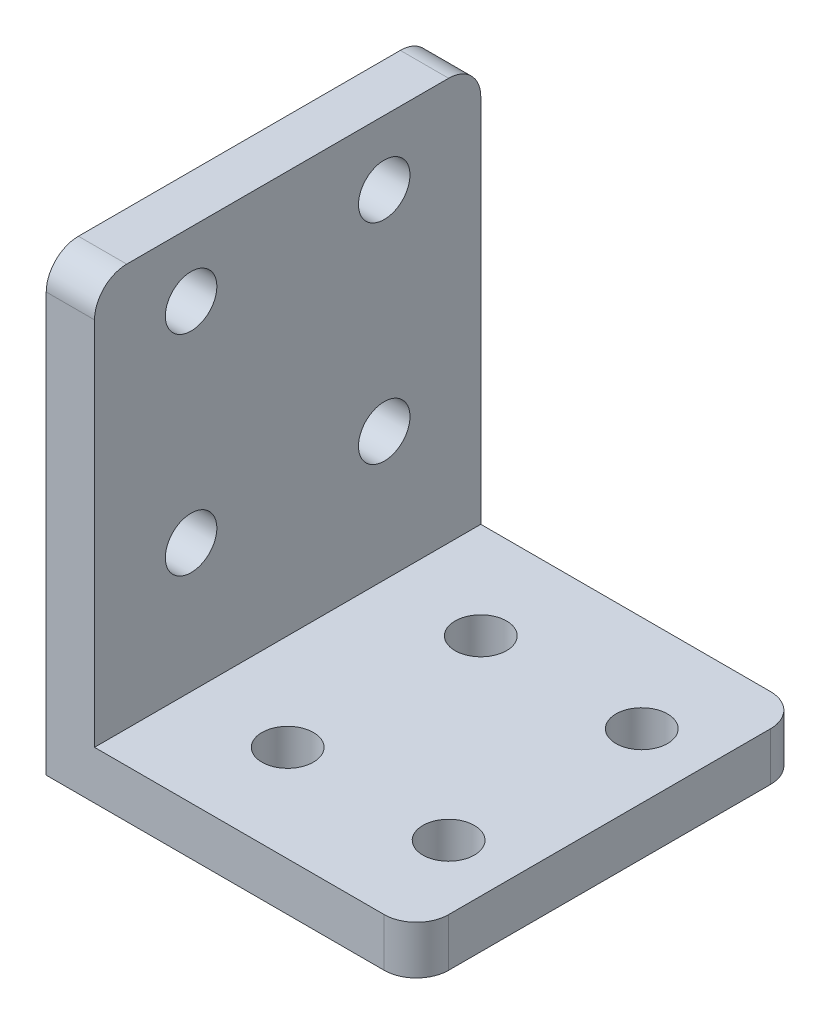
ISO-10303-21;
HEADER;
FILE_DESCRIPTION(('STEP AP214'),'2;1');
FILE_NAME('part.step','',(''),(''),'','','');
FILE_SCHEMA(('AUTOMOTIVE_DESIGN { 1 0 10303 214 1 1 1 1 }'));
ENDSEC;
DATA;
#1=APPLICATION_CONTEXT('core data for automotive mechanical design processes');
#2=APPLICATION_PROTOCOL_DEFINITION('international standard','automotive_design',2000,#1);
#3=PRODUCT_CONTEXT('',#1,'mechanical');
#4=PRODUCT('Part','Part','',(#3));
#5=PRODUCT_RELATED_PRODUCT_CATEGORY('part','',(#4));
#6=PRODUCT_DEFINITION_FORMATION('','',#4);
#7=PRODUCT_DEFINITION_CONTEXT('part definition',#1,'design');
#8=PRODUCT_DEFINITION('design','',#6,#7);
#9=PRODUCT_DEFINITION_SHAPE('','',#8);
#10=(LENGTH_UNIT() NAMED_UNIT(*) SI_UNIT(.MILLI.,.METRE.));
#11=(NAMED_UNIT(*) PLANE_ANGLE_UNIT() SI_UNIT($,.RADIAN.));
#12=(NAMED_UNIT(*) SI_UNIT($,.STERADIAN.) SOLID_ANGLE_UNIT());
#13=UNCERTAINTY_MEASURE_WITH_UNIT(LENGTH_MEASURE(1.E-05),#10,'distance_accuracy_value','');
#14=(GEOMETRIC_REPRESENTATION_CONTEXT(3) GLOBAL_UNCERTAINTY_ASSIGNED_CONTEXT((#13)) GLOBAL_UNIT_ASSIGNED_CONTEXT((#10,
#11,#12)) REPRESENTATION_CONTEXT('',''));
#15=CARTESIAN_POINT('',(0.,0.,0.));
#16=DIRECTION('',(0.,0.,1.));
#17=DIRECTION('',(1.,0.,0.));
#18=AXIS2_PLACEMENT_3D('',#15,#16,#17);
#19=CARTESIAN_POINT('',(0.,101.691622654979,-24.));
#20=DIRECTION('',(0.,-1.,0.));
#21=DIRECTION('',(0.,0.,-1.));
#22=AXIS2_PLACEMENT_3D('',#19,#20,#21);
#23=PLANE('',#22);
#24=CARTESIAN_POINT('',(12.0000000000001,101.691622654979,-18.));
#25=DIRECTION('',(0.,-1.,0.));
#26=DIRECTION('',(0.,0.,-1.));
#27=AXIS2_PLACEMENT_3D('',#24,#25,#26);
#28=CIRCLE('',#27,1.6);
#29=CARTESIAN_POINT('',(12.0000000000001,101.691622654979,-19.6));
#30=VERTEX_POINT('',#29);
#31=EDGE_CURVE('E211',#30,#30,#28,.T.);
#32=ORIENTED_EDGE('',*,*,#31,.F.);
#33=EDGE_LOOP('',(#32));
#34=FACE_BOUND('',#33,.T.);
#35=CARTESIAN_POINT('',(12.0000000000001,101.691622654979,-6.));
#36=DIRECTION('',(0.,-1.,0.));
#37=DIRECTION('',(0.,0.,-1.));
#38=AXIS2_PLACEMENT_3D('',#35,#36,#37);
#39=CIRCLE('',#38,1.6);
#40=CARTESIAN_POINT('',(12.0000000000001,101.691622654979,-7.6));
#41=VERTEX_POINT('',#40);
#42=EDGE_CURVE('E335',#41,#41,#39,.T.);
#43=ORIENTED_EDGE('',*,*,#42,.F.);
#44=EDGE_LOOP('',(#43));
#45=FACE_BOUND('',#44,.T.);
#46=CARTESIAN_POINT('',(22.0000000000001,101.691622654979,-6.));
#47=DIRECTION('',(0.,-1.,0.));
#48=DIRECTION('',(0.,0.,-1.));
#49=AXIS2_PLACEMENT_3D('',#46,#47,#48);
#50=CIRCLE('',#49,1.6);
#51=CARTESIAN_POINT('',(22.0000000000001,101.691622654979,-7.6));
#52=VERTEX_POINT('',#51);
#53=EDGE_CURVE('E224',#52,#52,#50,.T.);
#54=ORIENTED_EDGE('',*,*,#53,.F.);
#55=EDGE_LOOP('',(#54));
#56=FACE_BOUND('',#55,.T.);
#57=CARTESIAN_POINT('',(22.0000000000001,101.691622654979,-18.));
#58=DIRECTION('',(0.,-1.,0.));
#59=DIRECTION('',(0.,0.,-1.));
#60=AXIS2_PLACEMENT_3D('',#57,#58,#59);
#61=CIRCLE('',#60,1.6);
#62=CARTESIAN_POINT('',(22.0000000000001,101.691622654979,-19.6));
#63=VERTEX_POINT('',#62);
#64=EDGE_CURVE('E219',#63,#63,#61,.T.);
#65=ORIENTED_EDGE('',*,*,#64,.F.);
#66=EDGE_LOOP('',(#65));
#67=FACE_BOUND('',#66,.T.);
#68=DIRECTION('',(1.,0.,0.));
#69=VECTOR('',#68,1.);
#70=CARTESIAN_POINT('',(0.,101.691622654979,-24.));
#71=LINE('',#70,#69);
#72=CARTESIAN_POINT('',(3.00000000000017,101.691622654979,-24.));
#73=VERTEX_POINT('',#72);
#74=CARTESIAN_POINT('',(24.0000000000001,101.691622654979,-24.));
#75=VERTEX_POINT('',#74);
#76=EDGE_CURVE('E142',#73,#75,#71,.T.);
#77=ORIENTED_EDGE('',*,*,#76,.T.);
#78=CARTESIAN_POINT('',(24.0000000000001,101.691622654979,-22.));
#79=DIRECTION('',(0.,-1.,0.));
#80=DIRECTION('',(0.,0.,-1.));
#81=AXIS2_PLACEMENT_3D('',#78,#79,#80);
#82=CIRCLE('',#81,2.);
#83=CARTESIAN_POINT('',(26.0000000000001,101.691622654979,-22.));
#84=VERTEX_POINT('',#83);
#85=EDGE_CURVE('E183',#75,#84,#82,.T.);
#86=ORIENTED_EDGE('',*,*,#85,.T.);
#87=DIRECTION('',(0.,0.,1.));
#88=VECTOR('',#87,1.);
#89=CARTESIAN_POINT('',(26.0000000000001,101.691622654979,-24.));
#90=LINE('',#89,#88);
#91=CARTESIAN_POINT('',(26.0000000000001,101.691622654979,-2.));
#92=VERTEX_POINT('',#91);
#93=EDGE_CURVE('E150',#84,#92,#90,.T.);
#94=ORIENTED_EDGE('',*,*,#93,.T.);
#95=CARTESIAN_POINT('',(24.0000000000001,101.691622654979,-2.));
#96=DIRECTION('',(0.,-1.,0.));
#97=DIRECTION('',(0.,0.,-1.));
#98=AXIS2_PLACEMENT_3D('',#95,#96,#97);
#99=CIRCLE('',#98,2.);
#100=CARTESIAN_POINT('',(24.0000000000001,101.691622654979,0.));
#101=VERTEX_POINT('',#100);
#102=EDGE_CURVE('E181',#92,#101,#99,.T.);
#103=ORIENTED_EDGE('',*,*,#102,.T.);
#104=DIRECTION('',(1.,0.,0.));
#105=VECTOR('',#104,1.);
#106=CARTESIAN_POINT('',(0.,101.691622654979,0.));
#107=LINE('',#106,#105);
#108=CARTESIAN_POINT('',(3.00000000000017,101.691622654979,0.));
#109=VERTEX_POINT('',#108);
#110=EDGE_CURVE('E151',#109,#101,#107,.T.);
#111=ORIENTED_EDGE('',*,*,#110,.F.);
#112=DIRECTION('',(0.,0.,1.));
#113=VECTOR('',#112,1.);
#114=CARTESIAN_POINT('',(3.00000000000017,101.691622654979,-24.));
#115=LINE('',#114,#113);
#116=EDGE_CURVE('E159',#73,#109,#115,.T.);
#117=ORIENTED_EDGE('',*,*,#116,.F.);
#118=EDGE_LOOP('',(#77,#86,#94,#103,#111,#117));
#119=FACE_BOUND('',#118,.T.);
#120=ADVANCED_FACE('F36',(#34,#45,#56,#67,#119),#23,.T.);
#121=CARTESIAN_POINT('',(3.0000000000006,0.,-24.));
#122=DIRECTION('',(-1.,0.,0.));
#123=DIRECTION('',(0.,-1.,0.));
#124=AXIS2_PLACEMENT_3D('',#121,#122,#123);
#125=PLANE('',#124);
#126=CARTESIAN_POINT('',(3.00000000000012,112.691622654979,-18.0000000000001));
#127=DIRECTION('',(-1.,0.,0.));
#128=DIRECTION('',(0.,-1.,0.));
#129=AXIS2_PLACEMENT_3D('',#126,#127,#128);
#130=CIRCLE('',#129,1.60000000000001);
#131=CARTESIAN_POINT('',(3.00000000000013,111.091622654979,-18.0000000000001));
#132=VERTEX_POINT('',#131);
#133=EDGE_CURVE('E200',#132,#132,#130,.T.);
#134=ORIENTED_EDGE('',*,*,#133,.F.);
#135=EDGE_LOOP('',(#134));
#136=FACE_BOUND('',#135,.T.);
#137=CARTESIAN_POINT('',(3.00000000000012,112.691622654979,-6.00000000000011));
#138=DIRECTION('',(-1.,0.,0.));
#139=DIRECTION('',(0.,-1.,0.));
#140=AXIS2_PLACEMENT_3D('',#137,#138,#139);
#141=CIRCLE('',#140,1.60000000000002);
#142=CARTESIAN_POINT('',(3.00000000000013,111.091622654979,-6.00000000000011));
#143=VERTEX_POINT('',#142);
#144=EDGE_CURVE('E206',#143,#143,#141,.T.);
#145=ORIENTED_EDGE('',*,*,#144,.F.);
#146=EDGE_LOOP('',(#145));
#147=FACE_BOUND('',#146,.T.);
#148=CARTESIAN_POINT('',(3.00000000000007,125.691622654979,-6.));
#149=DIRECTION('',(-1.,0.,0.));
#150=DIRECTION('',(0.,-1.,0.));
#151=AXIS2_PLACEMENT_3D('',#148,#149,#150);
#152=CIRCLE('',#151,1.6);
#153=CARTESIAN_POINT('',(3.00000000000007,124.091622654979,-6.));
#154=VERTEX_POINT('',#153);
#155=EDGE_CURVE('E155',#154,#154,#152,.T.);
#156=ORIENTED_EDGE('',*,*,#155,.F.);
#157=EDGE_LOOP('',(#156));
#158=FACE_BOUND('',#157,.T.);
#159=CARTESIAN_POINT('',(3.00000000000007,125.691622654979,-18.));
#160=DIRECTION('',(-1.,0.,0.));
#161=DIRECTION('',(0.,-1.,0.));
#162=AXIS2_PLACEMENT_3D('',#159,#160,#161);
#163=CIRCLE('',#162,1.60000000000001);
#164=CARTESIAN_POINT('',(3.00000000000007,124.091622654979,-18.));
#165=VERTEX_POINT('',#164);
#166=EDGE_CURVE('E231',#165,#165,#163,.T.);
#167=ORIENTED_EDGE('',*,*,#166,.F.);
#168=EDGE_LOOP('',(#167));
#169=FACE_BOUND('',#168,.T.);
#170=DIRECTION('',(0.,0.,1.));
#171=VECTOR('',#170,1.);
#172=CARTESIAN_POINT('',(3.00000000000005,129.691622654979,-24.));
#173=LINE('',#172,#171);
#174=CARTESIAN_POINT('',(3.00000000000005,129.691622654979,-22.));
#175=VERTEX_POINT('',#174);
#176=CARTESIAN_POINT('',(3.00000000000005,129.691622654979,-2.));
#177=VERTEX_POINT('',#176);
#178=EDGE_CURVE('E163',#175,#177,#173,.T.);
#179=ORIENTED_EDGE('',*,*,#178,.F.);
#180=CARTESIAN_POINT('',(3.00000000000006,127.691622654979,-22.));
#181=DIRECTION('',(-1.,0.,0.));
#182=DIRECTION('',(0.,-1.,0.));
#183=AXIS2_PLACEMENT_3D('',#180,#181,#182);
#184=CIRCLE('',#183,2.);
#185=CARTESIAN_POINT('',(3.00000000000006,127.691622654979,-24.));
#186=VERTEX_POINT('',#185);
#187=EDGE_CURVE('E11',#175,#186,#184,.T.);
#188=ORIENTED_EDGE('',*,*,#187,.T.);
#189=DIRECTION('',(0.,-1.,0.));
#190=VECTOR('',#189,1.);
#191=CARTESIAN_POINT('',(3.0000000000006,0.,-24.));
#192=LINE('',#191,#190);
#193=EDGE_CURVE('E126',#186,#73,#192,.T.);
#194=ORIENTED_EDGE('',*,*,#193,.T.);
#195=ORIENTED_EDGE('',*,*,#116,.T.);
#196=DIRECTION('',(0.,-1.,0.));
#197=VECTOR('',#196,1.);
#198=CARTESIAN_POINT('',(3.0000000000006,0.,0.));
#199=LINE('',#198,#197);
#200=CARTESIAN_POINT('',(3.00000000000006,127.691622654979,0.));
#201=VERTEX_POINT('',#200);
#202=EDGE_CURVE('E145',#201,#109,#199,.T.);
#203=ORIENTED_EDGE('',*,*,#202,.F.);
#204=CARTESIAN_POINT('',(3.00000000000006,127.691622654979,-2.));
#205=DIRECTION('',(-1.,0.,0.));
#206=DIRECTION('',(0.,-1.,0.));
#207=AXIS2_PLACEMENT_3D('',#204,#205,#206);
#208=CIRCLE('',#207,2.);
#209=EDGE_CURVE('E45',#201,#177,#208,.T.);
#210=ORIENTED_EDGE('',*,*,#209,.T.);
#211=EDGE_LOOP('',(#179,#188,#194,#195,#203,#210));
#212=FACE_BOUND('',#211,.T.);
#213=ADVANCED_FACE('F241',(#136,#147,#158,#169,#212),#125,.T.);
#214=CARTESIAN_POINT('',(0.,129.691622654979,-24.));
#215=DIRECTION('',(0.,-1.,0.));
#216=DIRECTION('',(0.,0.,-1.));
#217=AXIS2_PLACEMENT_3D('',#214,#215,#216);
#218=PLANE('',#217);
#219=DIRECTION('',(0.,0.,1.));
#220=VECTOR('',#219,1.);
#221=CARTESIAN_POINT('',(6.00000000000005,129.691622654979,-24.));
#222=LINE('',#221,#220);
#223=CARTESIAN_POINT('',(6.00000000000005,129.691622654979,-22.));
#224=VERTEX_POINT('',#223);
#225=CARTESIAN_POINT('',(6.00000000000005,129.691622654979,-2.));
#226=VERTEX_POINT('',#225);
#227=EDGE_CURVE('E136',#224,#226,#222,.T.);
#228=ORIENTED_EDGE('',*,*,#227,.F.);
#229=DIRECTION('',(1.,0.,0.));
#230=VECTOR('',#229,1.);
#231=CARTESIAN_POINT('',(0.,129.691622654979,-22.));
#232=LINE('',#231,#230);
#233=EDGE_CURVE('E59',#224,#175,#232,.F.);
#234=ORIENTED_EDGE('',*,*,#233,.T.);
#235=ORIENTED_EDGE('',*,*,#178,.T.);
#236=DIRECTION('',(1.,0.,0.));
#237=VECTOR('',#236,1.);
#238=CARTESIAN_POINT('',(6.00000000000005,129.691622654979,-2.));
#239=LINE('',#238,#237);
#240=EDGE_CURVE('E194',#177,#226,#239,.T.);
#241=ORIENTED_EDGE('',*,*,#240,.T.);
#242=EDGE_LOOP('',(#228,#234,#235,#241));
#243=FACE_BOUND('',#242,.T.);
#244=ADVANCED_FACE('F244',(#243),#218,.F.);
#245=CARTESIAN_POINT('',(6.00000000000005,0.,-24.));
#246=DIRECTION('',(-1.,0.,0.));
#247=DIRECTION('',(0.,0.,1.));
#248=AXIS2_PLACEMENT_3D('',#245,#246,#247);
#249=PLANE('',#248);
#250=CARTESIAN_POINT('',(6.00000000000005,112.691622654979,-18.0000000000001));
#251=DIRECTION('',(-1.,0.,0.));
#252=DIRECTION('',(0.,0.,1.));
#253=AXIS2_PLACEMENT_3D('',#250,#251,#252);
#254=CIRCLE('',#253,1.60000000000001);
#255=CARTESIAN_POINT('',(6.00000000000005,112.691622654979,-16.4000000000001));
#256=VERTEX_POINT('',#255);
#257=EDGE_CURVE('E40',#256,#256,#254,.T.);
#258=ORIENTED_EDGE('',*,*,#257,.T.);
#259=EDGE_LOOP('',(#258));
#260=FACE_BOUND('',#259,.T.);
#261=CARTESIAN_POINT('',(6.00000000000005,112.691622654979,-6.00000000000011));
#262=DIRECTION('',(-1.,0.,0.));
#263=DIRECTION('',(0.,0.,1.));
#264=AXIS2_PLACEMENT_3D('',#261,#262,#263);
#265=CIRCLE('',#264,1.60000000000002);
#266=CARTESIAN_POINT('',(6.00000000000005,112.691622654979,-4.40000000000009));
#267=VERTEX_POINT('',#266);
#268=EDGE_CURVE('E198',#267,#267,#265,.T.);
#269=ORIENTED_EDGE('',*,*,#268,.T.);
#270=EDGE_LOOP('',(#269));
#271=FACE_BOUND('',#270,.T.);
#272=CARTESIAN_POINT('',(6.00000000000004,125.691622654979,-6.));
#273=DIRECTION('',(1.,0.,0.));
#274=DIRECTION('',(0.,1.,0.));
#275=AXIS2_PLACEMENT_3D('',#272,#273,#274);
#276=CIRCLE('',#275,1.6);
#277=CARTESIAN_POINT('',(6.00000000000004,127.291622654979,-6.));
#278=VERTEX_POINT('',#277);
#279=EDGE_CURVE('E228',#278,#278,#276,.T.);
#280=ORIENTED_EDGE('',*,*,#279,.F.);
#281=EDGE_LOOP('',(#280));
#282=FACE_BOUND('',#281,.T.);
#283=CARTESIAN_POINT('',(6.00000000000004,125.691622654979,-18.));
#284=DIRECTION('',(1.,0.,0.));
#285=DIRECTION('',(0.,1.,0.));
#286=AXIS2_PLACEMENT_3D('',#283,#284,#285);
#287=CIRCLE('',#286,1.60000000000001);
#288=CARTESIAN_POINT('',(6.00000000000004,127.291622654979,-18.));
#289=VERTEX_POINT('',#288);
#290=EDGE_CURVE('E227',#289,#289,#287,.T.);
#291=ORIENTED_EDGE('',*,*,#290,.F.);
#292=EDGE_LOOP('',(#291));
#293=FACE_BOUND('',#292,.T.);
#294=DIRECTION('',(0.,-1.,0.));
#295=VECTOR('',#294,1.);
#296=CARTESIAN_POINT('',(6.00000000000005,0.,-24.));
#297=LINE('',#296,#295);
#298=CARTESIAN_POINT('',(6.00000000000005,127.691622654979,-24.));
#299=VERTEX_POINT('',#298);
#300=CARTESIAN_POINT('',(6.00000000000005,104.691622654979,-24.));
#301=VERTEX_POINT('',#300);
#302=EDGE_CURVE('E116',#299,#301,#297,.T.);
#303=ORIENTED_EDGE('',*,*,#302,.F.);
#304=CARTESIAN_POINT('',(6.00000000000005,127.691622654979,-22.));
#305=DIRECTION('',(-1.,0.,0.));
#306=DIRECTION('',(0.,0.,1.));
#307=AXIS2_PLACEMENT_3D('',#304,#305,#306);
#308=CIRCLE('',#307,2.);
#309=EDGE_CURVE('E192',#299,#224,#308,.F.);
#310=ORIENTED_EDGE('',*,*,#309,.T.);
#311=ORIENTED_EDGE('',*,*,#227,.T.);
#312=CARTESIAN_POINT('',(6.00000000000005,127.691622654979,-2.));
#313=DIRECTION('',(-1.,0.,0.));
#314=DIRECTION('',(0.,0.,1.));
#315=AXIS2_PLACEMENT_3D('',#312,#313,#314);
#316=CIRCLE('',#315,2.);
#317=CARTESIAN_POINT('',(6.00000000000005,127.691622654979,0.));
#318=VERTEX_POINT('',#317);
#319=EDGE_CURVE('E190',#226,#318,#316,.F.);
#320=ORIENTED_EDGE('',*,*,#319,.T.);
#321=DIRECTION('',(0.,-1.,0.));
#322=VECTOR('',#321,1.);
#323=CARTESIAN_POINT('',(6.00000000000005,0.,0.));
#324=LINE('',#323,#322);
#325=CARTESIAN_POINT('',(6.00000000000005,104.691622654979,0.));
#326=VERTEX_POINT('',#325);
#327=EDGE_CURVE('E132',#318,#326,#324,.T.);
#328=ORIENTED_EDGE('',*,*,#327,.T.);
#329=DIRECTION('',(0.,0.,1.));
#330=VECTOR('',#329,1.);
#331=CARTESIAN_POINT('',(6.00000000000005,104.691622654979,-24.));
#332=LINE('',#331,#330);
#333=EDGE_CURVE('E129',#301,#326,#332,.T.);
#334=ORIENTED_EDGE('',*,*,#333,.F.);
#335=EDGE_LOOP('',(#303,#310,#311,#320,#328,#334));
#336=FACE_BOUND('',#335,.T.);
#337=ADVANCED_FACE('F130',(#260,#271,#282,#293,#336),#249,.F.);
#338=CARTESIAN_POINT('',(-7.2644406223079E-13,104.691622654979,-24.));
#339=DIRECTION('',(0.,-1.,0.));
#340=DIRECTION('',(1.,0.,0.));
#341=AXIS2_PLACEMENT_3D('',#338,#339,#340);
#342=PLANE('',#341);
#343=CARTESIAN_POINT('',(12.0000000000001,104.691622654979,-18.));
#344=DIRECTION('',(0.,1.,0.));
#345=DIRECTION('',(-1.,0.,0.));
#346=AXIS2_PLACEMENT_3D('',#343,#344,#345);
#347=CIRCLE('',#346,1.6);
#348=CARTESIAN_POINT('',(10.4000000000001,104.691622654979,-18.));
#349=VERTEX_POINT('',#348);
#350=EDGE_CURVE('E334',#349,#349,#347,.T.);
#351=ORIENTED_EDGE('',*,*,#350,.F.);
#352=EDGE_LOOP('',(#351));
#353=FACE_BOUND('',#352,.T.);
#354=CARTESIAN_POINT('',(12.0000000000001,104.691622654979,-6.));
#355=DIRECTION('',(0.,1.,0.));
#356=DIRECTION('',(-1.,0.,0.));
#357=AXIS2_PLACEMENT_3D('',#354,#355,#356);
#358=CIRCLE('',#357,1.6);
#359=CARTESIAN_POINT('',(10.4000000000001,104.691622654979,-6.));
#360=VERTEX_POINT('',#359);
#361=EDGE_CURVE('E336',#360,#360,#358,.T.);
#362=ORIENTED_EDGE('',*,*,#361,.F.);
#363=EDGE_LOOP('',(#362));
#364=FACE_BOUND('',#363,.T.);
#365=CARTESIAN_POINT('',(22.0000000000001,104.691622654979,-6.));
#366=DIRECTION('',(0.,1.,0.));
#367=DIRECTION('',(-1.,0.,0.));
#368=AXIS2_PLACEMENT_3D('',#365,#366,#367);
#369=CIRCLE('',#368,1.6);
#370=CARTESIAN_POINT('',(20.4000000000001,104.691622654979,-6.));
#371=VERTEX_POINT('',#370);
#372=EDGE_CURVE('E216',#371,#371,#369,.T.);
#373=ORIENTED_EDGE('',*,*,#372,.F.);
#374=EDGE_LOOP('',(#373));
#375=FACE_BOUND('',#374,.T.);
#376=CARTESIAN_POINT('',(22.0000000000001,104.691622654979,-18.));
#377=DIRECTION('',(0.,1.,0.));
#378=DIRECTION('',(-1.,0.,0.));
#379=AXIS2_PLACEMENT_3D('',#376,#377,#378);
#380=CIRCLE('',#379,1.6);
#381=CARTESIAN_POINT('',(20.4000000000001,104.691622654979,-18.));
#382=VERTEX_POINT('',#381);
#383=EDGE_CURVE('E204',#382,#382,#380,.T.);
#384=ORIENTED_EDGE('',*,*,#383,.F.);
#385=EDGE_LOOP('',(#384));
#386=FACE_BOUND('',#385,.T.);
#387=DIRECTION('',(0.,0.,1.));
#388=VECTOR('',#387,1.);
#389=CARTESIAN_POINT('',(26.0000000000001,104.691622654979,-24.));
#390=LINE('',#389,#388);
#391=CARTESIAN_POINT('',(26.0000000000001,104.691622654979,-22.));
#392=VERTEX_POINT('',#391);
#393=CARTESIAN_POINT('',(26.0000000000001,104.691622654979,-2.));
#394=VERTEX_POINT('',#393);
#395=EDGE_CURVE('E137',#392,#394,#390,.T.);
#396=ORIENTED_EDGE('',*,*,#395,.F.);
#397=CARTESIAN_POINT('',(24.0000000000001,104.691622654979,-22.));
#398=DIRECTION('',(0.,-1.,0.));
#399=DIRECTION('',(1.,0.,0.));
#400=AXIS2_PLACEMENT_3D('',#397,#398,#399);
#401=CIRCLE('',#400,2.);
#402=CARTESIAN_POINT('',(24.0000000000001,104.691622654979,-24.));
#403=VERTEX_POINT('',#402);
#404=EDGE_CURVE('E141',#392,#403,#401,.F.);
#405=ORIENTED_EDGE('',*,*,#404,.T.);
#406=DIRECTION('',(1.,0.,0.));
#407=VECTOR('',#406,1.);
#408=CARTESIAN_POINT('',(-7.2644406223079E-13,104.691622654979,-24.));
#409=LINE('',#408,#407);
#410=EDGE_CURVE('E120',#301,#403,#409,.T.);
#411=ORIENTED_EDGE('',*,*,#410,.F.);
#412=ORIENTED_EDGE('',*,*,#333,.T.);
#413=DIRECTION('',(1.,0.,0.));
#414=VECTOR('',#413,1.);
#415=CARTESIAN_POINT('',(-7.2644406223079E-13,104.691622654979,0.));
#416=LINE('',#415,#414);
#417=CARTESIAN_POINT('',(24.0000000000001,104.691622654979,0.));
#418=VERTEX_POINT('',#417);
#419=EDGE_CURVE('E154',#326,#418,#416,.T.);
#420=ORIENTED_EDGE('',*,*,#419,.T.);
#421=CARTESIAN_POINT('',(24.0000000000001,104.691622654979,-2.));
#422=DIRECTION('',(0.,-1.,0.));
#423=DIRECTION('',(1.,0.,0.));
#424=AXIS2_PLACEMENT_3D('',#421,#422,#423);
#425=CIRCLE('',#424,2.);
#426=EDGE_CURVE('E175',#418,#394,#425,.F.);
#427=ORIENTED_EDGE('',*,*,#426,.T.);
#428=EDGE_LOOP('',(#396,#405,#411,#412,#420,#427));
#429=FACE_BOUND('',#428,.T.);
#430=ADVANCED_FACE('F140',(#353,#364,#375,#386,#429),#342,.F.);
#431=CARTESIAN_POINT('',(26.0000000000001,0.,-24.));
#432=DIRECTION('',(1.,0.,0.));
#433=DIRECTION('',(0.,0.,-1.));
#434=AXIS2_PLACEMENT_3D('',#431,#432,#433);
#435=PLANE('',#434);
#436=ORIENTED_EDGE('',*,*,#93,.F.);
#437=DIRECTION('',(0.,1.,0.));
#438=VECTOR('',#437,1.);
#439=CARTESIAN_POINT('',(26.0000000000001,104.691622654979,-22.));
#440=LINE('',#439,#438);
#441=EDGE_CURVE('E172',#84,#392,#440,.T.);
#442=ORIENTED_EDGE('',*,*,#441,.T.);
#443=ORIENTED_EDGE('',*,*,#395,.T.);
#444=DIRECTION('',(0.,1.,0.));
#445=VECTOR('',#444,1.);
#446=CARTESIAN_POINT('',(26.0000000000001,0.,-2.));
#447=LINE('',#446,#445);
#448=EDGE_CURVE('E162',#394,#92,#447,.F.);
#449=ORIENTED_EDGE('',*,*,#448,.T.);
#450=EDGE_LOOP('',(#436,#442,#443,#449));
#451=FACE_BOUND('',#450,.T.);
#452=ADVANCED_FACE('F261',(#451),#435,.T.);
#453=CARTESIAN_POINT('',(0.,0.,-24.));
#454=DIRECTION('',(0.,0.,1.));
#455=DIRECTION('',(1.,0.,0.));
#456=AXIS2_PLACEMENT_3D('',#453,#454,#455);
#457=PLANE('',#456);
#458=ORIENTED_EDGE('',*,*,#410,.T.);
#459=DIRECTION('',(0.,1.,0.));
#460=VECTOR('',#459,1.);
#461=CARTESIAN_POINT('',(24.0000000000001,101.691622654979,-24.));
#462=LINE('',#461,#460);
#463=EDGE_CURVE('E179',#403,#75,#462,.F.);
#464=ORIENTED_EDGE('',*,*,#463,.T.);
#465=ORIENTED_EDGE('',*,*,#76,.F.);
#466=ORIENTED_EDGE('',*,*,#193,.F.);
#467=DIRECTION('',(1.,0.,0.));
#468=VECTOR('',#467,1.);
#469=CARTESIAN_POINT('',(0.,127.691622654979,-24.));
#470=LINE('',#469,#468);
#471=EDGE_CURVE('E124',#186,#299,#470,.T.);
#472=ORIENTED_EDGE('',*,*,#471,.T.);
#473=ORIENTED_EDGE('',*,*,#302,.T.);
#474=EDGE_LOOP('',(#458,#464,#465,#466,#472,#473));
#475=FACE_BOUND('',#474,.T.);
#476=ADVANCED_FACE('F118',(#475),#457,.F.);
#477=CARTESIAN_POINT('',(0.,0.,0.));
#478=DIRECTION('',(0.,0.,1.));
#479=DIRECTION('',(1.,0.,0.));
#480=AXIS2_PLACEMENT_3D('',#477,#478,#479);
#481=PLANE('',#480);
#482=ORIENTED_EDGE('',*,*,#110,.T.);
#483=DIRECTION('',(0.,1.,0.));
#484=VECTOR('',#483,1.);
#485=CARTESIAN_POINT('',(24.0000000000001,0.,0.));
#486=LINE('',#485,#484);
#487=EDGE_CURVE('E187',#101,#418,#486,.T.);
#488=ORIENTED_EDGE('',*,*,#487,.T.);
#489=ORIENTED_EDGE('',*,*,#419,.F.);
#490=ORIENTED_EDGE('',*,*,#327,.F.);
#491=DIRECTION('',(1.,0.,0.));
#492=VECTOR('',#491,1.);
#493=CARTESIAN_POINT('',(3.00000000000005,127.691622654979,0.));
#494=LINE('',#493,#492);
#495=EDGE_CURVE('E185',#318,#201,#494,.F.);
#496=ORIENTED_EDGE('',*,*,#495,.T.);
#497=ORIENTED_EDGE('',*,*,#202,.T.);
#498=EDGE_LOOP('',(#482,#488,#489,#490,#496,#497));
#499=FACE_BOUND('',#498,.T.);
#500=ADVANCED_FACE('F255',(#499),#481,.T.);
#501=CARTESIAN_POINT('',(-18.,125.691622654979,-18.));
#502=DIRECTION('',(1.,0.,0.));
#503=DIRECTION('',(0.,1.,0.));
#504=AXIS2_PLACEMENT_3D('',#501,#502,#503);
#505=CYLINDRICAL_SURFACE('',#504,1.60000000000001);
#506=ORIENTED_EDGE('',*,*,#166,.T.);
#507=EDGE_LOOP('',(#506));
#508=FACE_BOUND('',#507,.T.);
#509=ORIENTED_EDGE('',*,*,#290,.T.);
#510=EDGE_LOOP('',(#509));
#511=FACE_BOUND('',#510,.T.);
#512=ADVANCED_FACE('F303',(#508,#511),#505,.F.);
#513=CARTESIAN_POINT('',(-18.,125.691622654979,-6.));
#514=DIRECTION('',(1.,0.,0.));
#515=DIRECTION('',(0.,1.,0.));
#516=AXIS2_PLACEMENT_3D('',#513,#514,#515);
#517=CYLINDRICAL_SURFACE('',#516,1.6);
#518=ORIENTED_EDGE('',*,*,#155,.T.);
#519=EDGE_LOOP('',(#518));
#520=FACE_BOUND('',#519,.T.);
#521=ORIENTED_EDGE('',*,*,#279,.T.);
#522=EDGE_LOOP('',(#521));
#523=FACE_BOUND('',#522,.T.);
#524=ADVANCED_FACE('F238',(#520,#523),#517,.F.);
#525=CARTESIAN_POINT('',(22.0000000000001,80.6916226549791,-18.));
#526=DIRECTION('',(0.,1.,0.));
#527=DIRECTION('',(-1.,0.,0.));
#528=AXIS2_PLACEMENT_3D('',#525,#526,#527);
#529=CYLINDRICAL_SURFACE('',#528,1.6);
#530=ORIENTED_EDGE('',*,*,#64,.T.);
#531=EDGE_LOOP('',(#530));
#532=FACE_BOUND('',#531,.T.);
#533=ORIENTED_EDGE('',*,*,#383,.T.);
#534=EDGE_LOOP('',(#533));
#535=FACE_BOUND('',#534,.T.);
#536=ADVANCED_FACE('F280',(#532,#535),#529,.F.);
#537=CARTESIAN_POINT('',(22.0000000000001,80.6916226549791,-6.));
#538=DIRECTION('',(0.,1.,0.));
#539=DIRECTION('',(-1.,0.,0.));
#540=AXIS2_PLACEMENT_3D('',#537,#538,#539);
#541=CYLINDRICAL_SURFACE('',#540,1.6);
#542=ORIENTED_EDGE('',*,*,#53,.T.);
#543=EDGE_LOOP('',(#542));
#544=FACE_BOUND('',#543,.T.);
#545=ORIENTED_EDGE('',*,*,#372,.T.);
#546=EDGE_LOOP('',(#545));
#547=FACE_BOUND('',#546,.T.);
#548=ADVANCED_FACE('F273',(#544,#547),#541,.F.);
#549=CARTESIAN_POINT('',(24.0000000000001,0.,-22.));
#550=DIRECTION('',(0.,-1.,0.));
#551=DIRECTION('',(0.,0.,-1.));
#552=AXIS2_PLACEMENT_3D('',#549,#550,#551);
#553=CYLINDRICAL_SURFACE('',#552,2.);
#554=ORIENTED_EDGE('',*,*,#85,.F.);
#555=ORIENTED_EDGE('',*,*,#463,.F.);
#556=ORIENTED_EDGE('',*,*,#404,.F.);
#557=ORIENTED_EDGE('',*,*,#441,.F.);
#558=EDGE_LOOP('',(#554,#555,#556,#557));
#559=FACE_BOUND('',#558,.T.);
#560=ADVANCED_FACE('F271',(#559),#553,.T.);
#561=CARTESIAN_POINT('',(24.0000000000001,0.,-2.));
#562=DIRECTION('',(0.,1.,0.));
#563=DIRECTION('',(0.,0.,1.));
#564=AXIS2_PLACEMENT_3D('',#561,#562,#563);
#565=CYLINDRICAL_SURFACE('',#564,2.);
#566=ORIENTED_EDGE('',*,*,#102,.F.);
#567=ORIENTED_EDGE('',*,*,#448,.F.);
#568=ORIENTED_EDGE('',*,*,#426,.F.);
#569=ORIENTED_EDGE('',*,*,#487,.F.);
#570=EDGE_LOOP('',(#566,#567,#568,#569));
#571=FACE_BOUND('',#570,.T.);
#572=ADVANCED_FACE('F264',(#571),#565,.T.);
#573=CARTESIAN_POINT('',(0.,127.691622654979,-22.));
#574=DIRECTION('',(1.,0.,0.));
#575=DIRECTION('',(0.,0.,-1.));
#576=AXIS2_PLACEMENT_3D('',#573,#574,#575);
#577=CYLINDRICAL_SURFACE('',#576,2.);
#578=ORIENTED_EDGE('',*,*,#187,.F.);
#579=ORIENTED_EDGE('',*,*,#233,.F.);
#580=ORIENTED_EDGE('',*,*,#309,.F.);
#581=ORIENTED_EDGE('',*,*,#471,.F.);
#582=EDGE_LOOP('',(#578,#579,#580,#581));
#583=FACE_BOUND('',#582,.T.);
#584=ADVANCED_FACE('F251',(#583),#577,.T.);
#585=CARTESIAN_POINT('',(0.,127.691622654979,-2.));
#586=DIRECTION('',(-1.,0.,0.));
#587=DIRECTION('',(0.,0.,1.));
#588=AXIS2_PLACEMENT_3D('',#585,#586,#587);
#589=CYLINDRICAL_SURFACE('',#588,2.);
#590=ORIENTED_EDGE('',*,*,#209,.F.);
#591=ORIENTED_EDGE('',*,*,#495,.F.);
#592=ORIENTED_EDGE('',*,*,#319,.F.);
#593=ORIENTED_EDGE('',*,*,#240,.F.);
#594=EDGE_LOOP('',(#590,#591,#592,#593));
#595=FACE_BOUND('',#594,.T.);
#596=ADVANCED_FACE('F38',(#595),#589,.T.);
#597=CARTESIAN_POINT('',(7.00000000000012,112.691622654979,-6.00000000000011));
#598=DIRECTION('',(-1.,0.,0.));
#599=DIRECTION('',(0.,-1.,0.));
#600=AXIS2_PLACEMENT_3D('',#597,#598,#599);
#601=CYLINDRICAL_SURFACE('',#600,1.60000000000002);
#602=ORIENTED_EDGE('',*,*,#144,.T.);
#603=EDGE_LOOP('',(#602));
#604=FACE_BOUND('',#603,.T.);
#605=ORIENTED_EDGE('',*,*,#268,.F.);
#606=EDGE_LOOP('',(#605));
#607=FACE_BOUND('',#606,.T.);
#608=ADVANCED_FACE('F314',(#604,#607),#601,.F.);
#609=CARTESIAN_POINT('',(7.00000000000012,112.691622654979,-18.0000000000001));
#610=DIRECTION('',(-1.,0.,0.));
#611=DIRECTION('',(0.,-1.,0.));
#612=AXIS2_PLACEMENT_3D('',#609,#610,#611);
#613=CYLINDRICAL_SURFACE('',#612,1.60000000000001);
#614=ORIENTED_EDGE('',*,*,#133,.T.);
#615=EDGE_LOOP('',(#614));
#616=FACE_BOUND('',#615,.T.);
#617=ORIENTED_EDGE('',*,*,#257,.F.);
#618=EDGE_LOOP('',(#617));
#619=FACE_BOUND('',#618,.T.);
#620=ADVANCED_FACE('F317',(#616,#619),#613,.F.);
#621=CARTESIAN_POINT('',(12.0000000000001,100.691622654979,-6.));
#622=DIRECTION('',(0.,1.,0.));
#623=DIRECTION('',(-1.,0.,0.));
#624=AXIS2_PLACEMENT_3D('',#621,#622,#623);
#625=CYLINDRICAL_SURFACE('',#624,1.6);
#626=ORIENTED_EDGE('',*,*,#42,.T.);
#627=EDGE_LOOP('',(#626));
#628=FACE_BOUND('',#627,.T.);
#629=ORIENTED_EDGE('',*,*,#361,.T.);
#630=EDGE_LOOP('',(#629));
#631=FACE_BOUND('',#630,.T.);
#632=ADVANCED_FACE('F321',(#628,#631),#625,.F.);
#633=CARTESIAN_POINT('',(12.0000000000001,100.691622654979,-18.));
#634=DIRECTION('',(0.,1.,0.));
#635=DIRECTION('',(-1.,0.,0.));
#636=AXIS2_PLACEMENT_3D('',#633,#634,#635);
#637=CYLINDRICAL_SURFACE('',#636,1.6);
#638=ORIENTED_EDGE('',*,*,#31,.T.);
#639=EDGE_LOOP('',(#638));
#640=FACE_BOUND('',#639,.T.);
#641=ORIENTED_EDGE('',*,*,#350,.T.);
#642=EDGE_LOOP('',(#641));
#643=FACE_BOUND('',#642,.T.);
#644=ADVANCED_FACE('F324',(#640,#643),#637,.F.);
#645=CLOSED_SHELL('',(#120,#213,#244,#337,#430,#452,#476,#500,#512,#524,#536,#548,#560,#572,
#584,#596,#608,#620,#632,#644));
#646=MANIFOLD_SOLID_BREP('B2',#645);
#647=ADVANCED_BREP_SHAPE_REPRESENTATION('',(#18,#646),#14);
#648=SHAPE_DEFINITION_REPRESENTATION(#9,#647);
ENDSEC;
END-ISO-10303-21;
